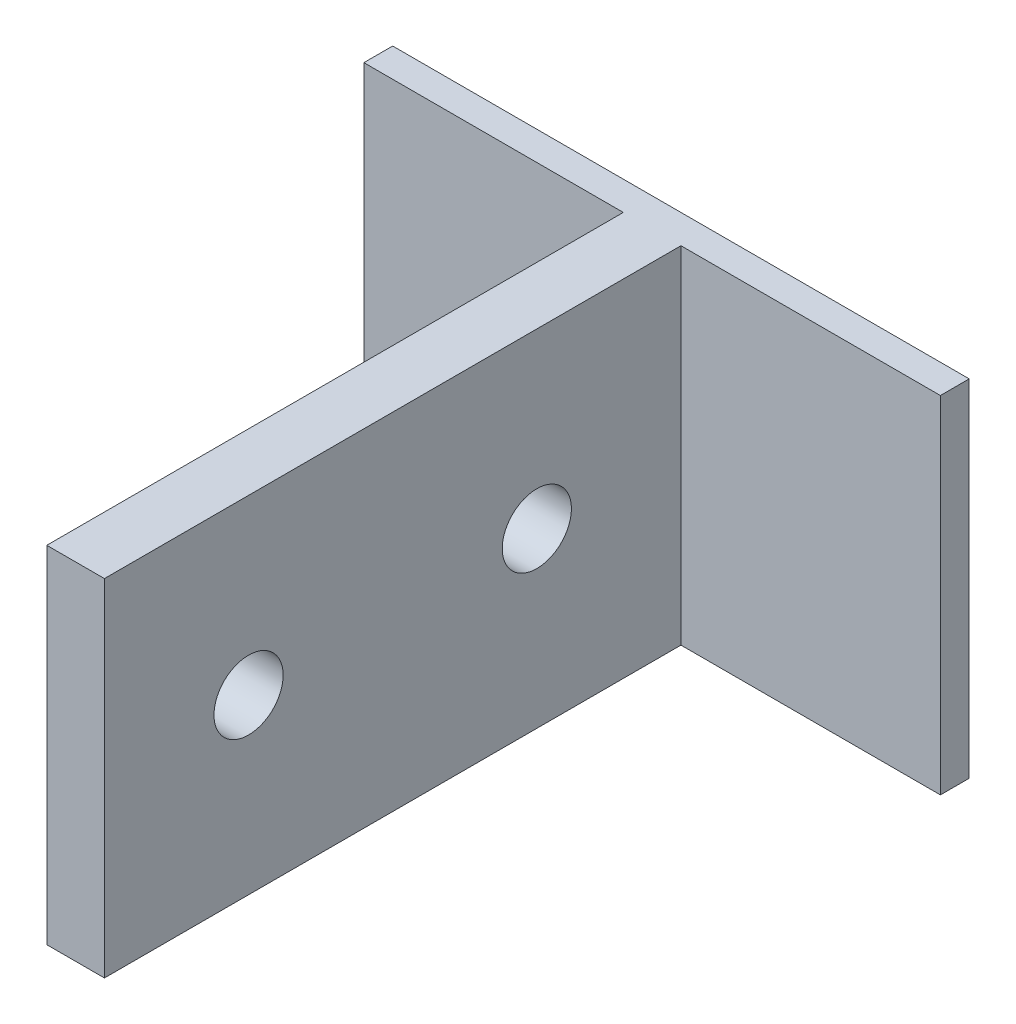
ISO-10303-21;
HEADER;
FILE_DESCRIPTION(('STEP AP214'),'2;1');
FILE_NAME('part.step','',(''),(''),'','','');
FILE_SCHEMA(('AUTOMOTIVE_DESIGN { 1 0 10303 214 1 1 1 1 }'));
ENDSEC;
DATA;
#1=APPLICATION_CONTEXT('core data for automotive mechanical design processes');
#2=APPLICATION_PROTOCOL_DEFINITION('international standard','automotive_design',2000,#1);
#3=PRODUCT_CONTEXT('',#1,'mechanical');
#4=PRODUCT('Part','Part','',(#3));
#5=PRODUCT_RELATED_PRODUCT_CATEGORY('part','',(#4));
#6=PRODUCT_DEFINITION_FORMATION('','',#4);
#7=PRODUCT_DEFINITION_CONTEXT('part definition',#1,'design');
#8=PRODUCT_DEFINITION('design','',#6,#7);
#9=PRODUCT_DEFINITION_SHAPE('','',#8);
#10=(LENGTH_UNIT() NAMED_UNIT(*) SI_UNIT(.MILLI.,.METRE.));
#11=(NAMED_UNIT(*) PLANE_ANGLE_UNIT() SI_UNIT($,.RADIAN.));
#12=(NAMED_UNIT(*) SI_UNIT($,.STERADIAN.) SOLID_ANGLE_UNIT());
#13=UNCERTAINTY_MEASURE_WITH_UNIT(LENGTH_MEASURE(1.E-05),#10,'distance_accuracy_value','');
#14=(GEOMETRIC_REPRESENTATION_CONTEXT(3) GLOBAL_UNCERTAINTY_ASSIGNED_CONTEXT((#13)) GLOBAL_UNIT_ASSIGNED_CONTEXT((#10,
#11,#12)) REPRESENTATION_CONTEXT('',''));
#15=CARTESIAN_POINT('',(0.,0.,0.));
#16=DIRECTION('',(0.,0.,1.));
#17=DIRECTION('',(1.,0.,0.));
#18=AXIS2_PLACEMENT_3D('',#15,#16,#17);
#19=CARTESIAN_POINT('',(0.,0.,0.));
#20=DIRECTION('',(0.,0.,1.));
#21=DIRECTION('',(1.,0.,0.));
#22=AXIS2_PLACEMENT_3D('',#19,#20,#21);
#23=PLANE('',#22);
#24=DIRECTION('',(1.,0.,0.));
#25=VECTOR('',#24,1.);
#26=CARTESIAN_POINT('',(-50.,30.,0.));
#27=LINE('',#26,#25);
#28=CARTESIAN_POINT('',(4.99999999999999,30.,0.));
#29=VERTEX_POINT('',#28);
#30=CARTESIAN_POINT('',(50.,30.,0.));
#31=VERTEX_POINT('',#30);
#32=EDGE_CURVE('E58',#29,#31,#27,.T.);
#33=ORIENTED_EDGE('',*,*,#32,.F.);
#34=DIRECTION('',(0.,-1.,0.));
#35=VECTOR('',#34,1.);
#36=CARTESIAN_POINT('',(4.99999999999999,0.,0.));
#37=LINE('',#36,#35);
#38=CARTESIAN_POINT('',(4.99999999999999,-30.,0.));
#39=VERTEX_POINT('',#38);
#40=EDGE_CURVE('E113',#29,#39,#37,.T.);
#41=ORIENTED_EDGE('',*,*,#40,.T.);
#42=DIRECTION('',(1.,0.,0.));
#43=VECTOR('',#42,1.);
#44=CARTESIAN_POINT('',(-50.,-30.,0.));
#45=LINE('',#44,#43);
#46=CARTESIAN_POINT('',(50.,-30.,0.));
#47=VERTEX_POINT('',#46);
#48=EDGE_CURVE('E116',#39,#47,#45,.T.);
#49=ORIENTED_EDGE('',*,*,#48,.T.);
#50=DIRECTION('',(0.,1.,0.));
#51=VECTOR('',#50,1.);
#52=CARTESIAN_POINT('',(50.,-30.,0.));
#53=LINE('',#52,#51);
#54=EDGE_CURVE('E158',#47,#31,#53,.T.);
#55=ORIENTED_EDGE('',*,*,#54,.T.);
#56=EDGE_LOOP('',(#33,#41,#49,#55));
#57=FACE_BOUND('',#56,.T.);
#58=ADVANCED_FACE('F41',(#57),#23,.T.);
#59=CARTESIAN_POINT('',(-50.,-30.,-5.));
#60=DIRECTION('',(0.,-1.,0.));
#61=DIRECTION('',(0.,0.,-1.));
#62=AXIS2_PLACEMENT_3D('',#59,#60,#61);
#63=PLANE('',#62);
#64=CARTESIAN_POINT('',(-50.,-30.,0.));
#65=VERTEX_POINT('',#64);
#66=CARTESIAN_POINT('',(-4.99999999999999,-30.,0.));
#67=VERTEX_POINT('',#66);
#68=EDGE_CURVE('E156',#65,#67,#45,.T.);
#69=ORIENTED_EDGE('',*,*,#68,.F.);
#70=DIRECTION('',(0.,0.,1.));
#71=VECTOR('',#70,1.);
#72=CARTESIAN_POINT('',(-50.,-30.,-5.));
#73=LINE('',#72,#71);
#74=CARTESIAN_POINT('',(-50.,-30.,-5.));
#75=VERTEX_POINT('',#74);
#76=EDGE_CURVE('E11',#75,#65,#73,.T.);
#77=ORIENTED_EDGE('',*,*,#76,.F.);
#78=DIRECTION('',(1.,0.,0.));
#79=VECTOR('',#78,1.);
#80=CARTESIAN_POINT('',(-50.,-30.,-5.));
#81=LINE('',#80,#79);
#82=CARTESIAN_POINT('',(50.,-30.,-5.));
#83=VERTEX_POINT('',#82);
#84=EDGE_CURVE('E144',#75,#83,#81,.T.);
#85=ORIENTED_EDGE('',*,*,#84,.T.);
#86=DIRECTION('',(0.,0.,1.));
#87=VECTOR('',#86,1.);
#88=CARTESIAN_POINT('',(50.,-30.,-5.));
#89=LINE('',#88,#87);
#90=EDGE_CURVE('E155',#83,#47,#89,.T.);
#91=ORIENTED_EDGE('',*,*,#90,.T.);
#92=ORIENTED_EDGE('',*,*,#48,.F.);
#93=DIRECTION('',(0.,0.,-1.));
#94=VECTOR('',#93,1.);
#95=CARTESIAN_POINT('',(4.99999999999999,-30.,100.));
#96=LINE('',#95,#94);
#97=CARTESIAN_POINT('',(4.99999999999999,-30.,100.));
#98=VERTEX_POINT('',#97);
#99=EDGE_CURVE('E136',#98,#39,#96,.T.);
#100=ORIENTED_EDGE('',*,*,#99,.F.);
#101=DIRECTION('',(1.,0.,0.));
#102=VECTOR('',#101,1.);
#103=CARTESIAN_POINT('',(0.,-30.,100.));
#104=LINE('',#103,#102);
#105=CARTESIAN_POINT('',(-4.99999999999999,-30.,100.));
#106=VERTEX_POINT('',#105);
#107=EDGE_CURVE('E124',#106,#98,#104,.T.);
#108=ORIENTED_EDGE('',*,*,#107,.F.);
#109=DIRECTION('',(0.,0.,-1.));
#110=VECTOR('',#109,1.);
#111=CARTESIAN_POINT('',(-4.99999999999999,-30.,100.));
#112=LINE('',#111,#110);
#113=EDGE_CURVE('E140',#106,#67,#112,.T.);
#114=ORIENTED_EDGE('',*,*,#113,.T.);
#115=EDGE_LOOP('',(#69,#77,#85,#91,#92,#100,#108,#114));
#116=FACE_BOUND('',#115,.T.);
#117=ADVANCED_FACE('F43',(#116),#63,.T.);
#118=CARTESIAN_POINT('',(-50.,-30.,-5.));
#119=DIRECTION('',(1.,0.,0.));
#120=DIRECTION('',(0.,0.,-1.));
#121=AXIS2_PLACEMENT_3D('',#118,#119,#120);
#122=PLANE('',#121);
#123=DIRECTION('',(0.,1.,0.));
#124=VECTOR('',#123,1.);
#125=CARTESIAN_POINT('',(-50.,-30.,0.));
#126=LINE('',#125,#124);
#127=CARTESIAN_POINT('',(-50.,30.,0.));
#128=VERTEX_POINT('',#127);
#129=EDGE_CURVE('E148',#65,#128,#126,.T.);
#130=ORIENTED_EDGE('',*,*,#129,.T.);
#131=DIRECTION('',(0.,0.,1.));
#132=VECTOR('',#131,1.);
#133=CARTESIAN_POINT('',(-50.,30.,-5.));
#134=LINE('',#133,#132);
#135=CARTESIAN_POINT('',(-50.,30.,-5.));
#136=VERTEX_POINT('',#135);
#137=EDGE_CURVE('E50',#136,#128,#134,.T.);
#138=ORIENTED_EDGE('',*,*,#137,.F.);
#139=DIRECTION('',(0.,1.,0.));
#140=VECTOR('',#139,1.);
#141=CARTESIAN_POINT('',(-50.,-30.,-5.));
#142=LINE('',#141,#140);
#143=EDGE_CURVE('E153',#75,#136,#142,.T.);
#144=ORIENTED_EDGE('',*,*,#143,.F.);
#145=ORIENTED_EDGE('',*,*,#76,.T.);
#146=EDGE_LOOP('',(#130,#138,#144,#145));
#147=FACE_BOUND('',#146,.T.);
#148=ADVANCED_FACE('F206',(#147),#122,.F.);
#149=CARTESIAN_POINT('',(-50.,30.,-5.));
#150=DIRECTION('',(0.,-1.,0.));
#151=DIRECTION('',(0.,0.,-1.));
#152=AXIS2_PLACEMENT_3D('',#149,#150,#151);
#153=PLANE('',#152);
#154=CARTESIAN_POINT('',(-4.99999999999999,30.,0.));
#155=VERTEX_POINT('',#154);
#156=EDGE_CURVE('E160',#128,#155,#27,.T.);
#157=ORIENTED_EDGE('',*,*,#156,.T.);
#158=DIRECTION('',(0.,0.,-1.));
#159=VECTOR('',#158,1.);
#160=CARTESIAN_POINT('',(-4.99999999999999,30.,100.));
#161=LINE('',#160,#159);
#162=CARTESIAN_POINT('',(-4.99999999999999,30.,100.));
#163=VERTEX_POINT('',#162);
#164=EDGE_CURVE('E117',#163,#155,#161,.T.);
#165=ORIENTED_EDGE('',*,*,#164,.F.);
#166=DIRECTION('',(1.,0.,0.));
#167=VECTOR('',#166,1.);
#168=CARTESIAN_POINT('',(0.,30.,100.));
#169=LINE('',#168,#167);
#170=CARTESIAN_POINT('',(4.99999999999999,30.,100.));
#171=VERTEX_POINT('',#170);
#172=EDGE_CURVE('E122',#163,#171,#169,.T.);
#173=ORIENTED_EDGE('',*,*,#172,.T.);
#174=DIRECTION('',(0.,0.,-1.));
#175=VECTOR('',#174,1.);
#176=CARTESIAN_POINT('',(4.99999999999999,30.,100.));
#177=LINE('',#176,#175);
#178=EDGE_CURVE('E108',#171,#29,#177,.T.);
#179=ORIENTED_EDGE('',*,*,#178,.T.);
#180=ORIENTED_EDGE('',*,*,#32,.T.);
#181=DIRECTION('',(0.,0.,1.));
#182=VECTOR('',#181,1.);
#183=CARTESIAN_POINT('',(50.,30.,-5.));
#184=LINE('',#183,#182);
#185=CARTESIAN_POINT('',(50.,30.,-5.));
#186=VERTEX_POINT('',#185);
#187=EDGE_CURVE('E165',#186,#31,#184,.T.);
#188=ORIENTED_EDGE('',*,*,#187,.F.);
#189=DIRECTION('',(1.,0.,0.));
#190=VECTOR('',#189,1.);
#191=CARTESIAN_POINT('',(-50.,30.,-5.));
#192=LINE('',#191,#190);
#193=EDGE_CURVE('E151',#136,#186,#192,.T.);
#194=ORIENTED_EDGE('',*,*,#193,.F.);
#195=ORIENTED_EDGE('',*,*,#137,.T.);
#196=EDGE_LOOP('',(#157,#165,#173,#179,#180,#188,#194,#195));
#197=FACE_BOUND('',#196,.T.);
#198=ADVANCED_FACE('F127',(#197),#153,.F.);
#199=CARTESIAN_POINT('',(50.,-30.,-5.));
#200=DIRECTION('',(1.,0.,0.));
#201=DIRECTION('',(0.,0.,-1.));
#202=AXIS2_PLACEMENT_3D('',#199,#200,#201);
#203=PLANE('',#202);
#204=ORIENTED_EDGE('',*,*,#54,.F.);
#205=ORIENTED_EDGE('',*,*,#90,.F.);
#206=DIRECTION('',(0.,1.,0.));
#207=VECTOR('',#206,1.);
#208=CARTESIAN_POINT('',(50.,-30.,-5.));
#209=LINE('',#208,#207);
#210=EDGE_CURVE('E147',#83,#186,#209,.T.);
#211=ORIENTED_EDGE('',*,*,#210,.T.);
#212=ORIENTED_EDGE('',*,*,#187,.T.);
#213=EDGE_LOOP('',(#204,#205,#211,#212));
#214=FACE_BOUND('',#213,.T.);
#215=ADVANCED_FACE('F213',(#214),#203,.T.);
#216=CARTESIAN_POINT('',(0.,0.,-5.));
#217=DIRECTION('',(0.,0.,1.));
#218=DIRECTION('',(1.,0.,0.));
#219=AXIS2_PLACEMENT_3D('',#216,#217,#218);
#220=PLANE('',#219);
#221=ORIENTED_EDGE('',*,*,#84,.F.);
#222=ORIENTED_EDGE('',*,*,#143,.T.);
#223=ORIENTED_EDGE('',*,*,#193,.T.);
#224=ORIENTED_EDGE('',*,*,#210,.F.);
#225=EDGE_LOOP('',(#221,#222,#223,#224));
#226=FACE_BOUND('',#225,.T.);
#227=ADVANCED_FACE('F198',(#226),#220,.F.);
#228=DIRECTION('',(0.,-1.,0.));
#229=VECTOR('',#228,1.);
#230=CARTESIAN_POINT('',(-4.99999999999999,0.,0.));
#231=LINE('',#230,#229);
#232=EDGE_CURVE('E66',#155,#67,#231,.T.);
#233=ORIENTED_EDGE('',*,*,#232,.F.);
#234=ORIENTED_EDGE('',*,*,#156,.F.);
#235=ORIENTED_EDGE('',*,*,#129,.F.);
#236=ORIENTED_EDGE('',*,*,#68,.T.);
#237=EDGE_LOOP('',(#233,#234,#235,#236));
#238=FACE_BOUND('',#237,.T.);
#239=ADVANCED_FACE('F188',(#238),#23,.T.);
#240=CARTESIAN_POINT('',(4.99999999999999,0.,100.));
#241=DIRECTION('',(1.,0.,0.));
#242=DIRECTION('',(0.,0.,-1.));
#243=AXIS2_PLACEMENT_3D('',#240,#241,#242);
#244=PLANE('',#243);
#245=CARTESIAN_POINT('',(4.99999999999999,0.,75.));
#246=DIRECTION('',(1.,0.,0.));
#247=DIRECTION('',(0.,0.,-1.));
#248=AXIS2_PLACEMENT_3D('',#245,#246,#247);
#249=CIRCLE('',#248,6.);
#250=CARTESIAN_POINT('',(4.99999999999999,0.,69.));
#251=VERTEX_POINT('',#250);
#252=EDGE_CURVE('E171',#251,#251,#249,.T.);
#253=ORIENTED_EDGE('',*,*,#252,.F.);
#254=EDGE_LOOP('',(#253));
#255=FACE_BOUND('',#254,.T.);
#256=CARTESIAN_POINT('',(4.99999999999999,0.,25.));
#257=DIRECTION('',(1.,0.,0.));
#258=DIRECTION('',(0.,0.,-1.));
#259=AXIS2_PLACEMENT_3D('',#256,#257,#258);
#260=CIRCLE('',#259,6.);
#261=CARTESIAN_POINT('',(4.99999999999999,0.,19.));
#262=VERTEX_POINT('',#261);
#263=EDGE_CURVE('E176',#262,#262,#260,.T.);
#264=ORIENTED_EDGE('',*,*,#263,.F.);
#265=EDGE_LOOP('',(#264));
#266=FACE_BOUND('',#265,.T.);
#267=ORIENTED_EDGE('',*,*,#40,.F.);
#268=ORIENTED_EDGE('',*,*,#178,.F.);
#269=DIRECTION('',(0.,-1.,0.));
#270=VECTOR('',#269,1.);
#271=CARTESIAN_POINT('',(4.99999999999999,0.,100.));
#272=LINE('',#271,#270);
#273=EDGE_CURVE('E112',#171,#98,#272,.T.);
#274=ORIENTED_EDGE('',*,*,#273,.T.);
#275=ORIENTED_EDGE('',*,*,#99,.T.);
#276=EDGE_LOOP('',(#267,#268,#274,#275));
#277=FACE_BOUND('',#276,.T.);
#278=ADVANCED_FACE('F110',(#255,#266,#277),#244,.T.);
#279=CARTESIAN_POINT('',(-4.99999999999999,0.,100.));
#280=DIRECTION('',(1.,0.,0.));
#281=DIRECTION('',(0.,0.,-1.));
#282=AXIS2_PLACEMENT_3D('',#279,#280,#281);
#283=PLANE('',#282);
#284=CARTESIAN_POINT('',(-4.99999999999999,0.,75.));
#285=DIRECTION('',(1.,0.,0.));
#286=DIRECTION('',(0.,0.,-1.));
#287=AXIS2_PLACEMENT_3D('',#284,#285,#286);
#288=CIRCLE('',#287,6.);
#289=CARTESIAN_POINT('',(-4.99999999999999,0.,69.));
#290=VERTEX_POINT('',#289);
#291=EDGE_CURVE('E45',#290,#290,#288,.T.);
#292=ORIENTED_EDGE('',*,*,#291,.T.);
#293=EDGE_LOOP('',(#292));
#294=FACE_BOUND('',#293,.T.);
#295=CARTESIAN_POINT('',(-4.99999999999999,0.,25.));
#296=DIRECTION('',(1.,0.,0.));
#297=DIRECTION('',(0.,0.,-1.));
#298=AXIS2_PLACEMENT_3D('',#295,#296,#297);
#299=CIRCLE('',#298,6.);
#300=CARTESIAN_POINT('',(-4.99999999999999,0.,19.));
#301=VERTEX_POINT('',#300);
#302=EDGE_CURVE('E169',#301,#301,#299,.T.);
#303=ORIENTED_EDGE('',*,*,#302,.T.);
#304=EDGE_LOOP('',(#303));
#305=FACE_BOUND('',#304,.T.);
#306=ORIENTED_EDGE('',*,*,#232,.T.);
#307=ORIENTED_EDGE('',*,*,#113,.F.);
#308=DIRECTION('',(0.,-1.,0.));
#309=VECTOR('',#308,1.);
#310=CARTESIAN_POINT('',(-4.99999999999999,0.,100.));
#311=LINE('',#310,#309);
#312=EDGE_CURVE('E130',#163,#106,#311,.T.);
#313=ORIENTED_EDGE('',*,*,#312,.F.);
#314=ORIENTED_EDGE('',*,*,#164,.T.);
#315=EDGE_LOOP('',(#306,#307,#313,#314));
#316=FACE_BOUND('',#315,.T.);
#317=ADVANCED_FACE('F187',(#294,#305,#316),#283,.F.);
#318=CARTESIAN_POINT('',(0.,0.,100.));
#319=DIRECTION('',(0.,0.,1.));
#320=DIRECTION('',(1.,0.,0.));
#321=AXIS2_PLACEMENT_3D('',#318,#319,#320);
#322=PLANE('',#321);
#323=ORIENTED_EDGE('',*,*,#273,.F.);
#324=ORIENTED_EDGE('',*,*,#172,.F.);
#325=ORIENTED_EDGE('',*,*,#312,.T.);
#326=ORIENTED_EDGE('',*,*,#107,.T.);
#327=EDGE_LOOP('',(#323,#324,#325,#326));
#328=FACE_BOUND('',#327,.T.);
#329=ADVANCED_FACE('F121',(#328),#322,.T.);
#330=CARTESIAN_POINT('',(-15.,0.,25.));
#331=DIRECTION('',(1.,0.,0.));
#332=DIRECTION('',(0.,0.,-1.));
#333=AXIS2_PLACEMENT_3D('',#330,#331,#332);
#334=CYLINDRICAL_SURFACE('',#333,6.);
#335=ORIENTED_EDGE('',*,*,#263,.T.);
#336=EDGE_LOOP('',(#335));
#337=FACE_BOUND('',#336,.T.);
#338=ORIENTED_EDGE('',*,*,#302,.F.);
#339=EDGE_LOOP('',(#338));
#340=FACE_BOUND('',#339,.T.);
#341=ADVANCED_FACE('F183',(#337,#340),#334,.F.);
#342=CARTESIAN_POINT('',(-15.,0.,75.));
#343=DIRECTION('',(1.,0.,0.));
#344=DIRECTION('',(0.,0.,-1.));
#345=AXIS2_PLACEMENT_3D('',#342,#343,#344);
#346=CYLINDRICAL_SURFACE('',#345,6.);
#347=ORIENTED_EDGE('',*,*,#252,.T.);
#348=EDGE_LOOP('',(#347));
#349=FACE_BOUND('',#348,.T.);
#350=ORIENTED_EDGE('',*,*,#291,.F.);
#351=EDGE_LOOP('',(#350));
#352=FACE_BOUND('',#351,.T.);
#353=ADVANCED_FACE('F296',(#349,#352),#346,.F.);
#354=CLOSED_SHELL('',(#58,#117,#148,#198,#215,#227,#239,#278,#317,#329,#341,#353));
#355=MANIFOLD_SOLID_BREP('B2',#354);
#356=ADVANCED_BREP_SHAPE_REPRESENTATION('',(#18,#355),#14);
#357=SHAPE_DEFINITION_REPRESENTATION(#9,#356);
ENDSEC;
END-ISO-10303-21;
